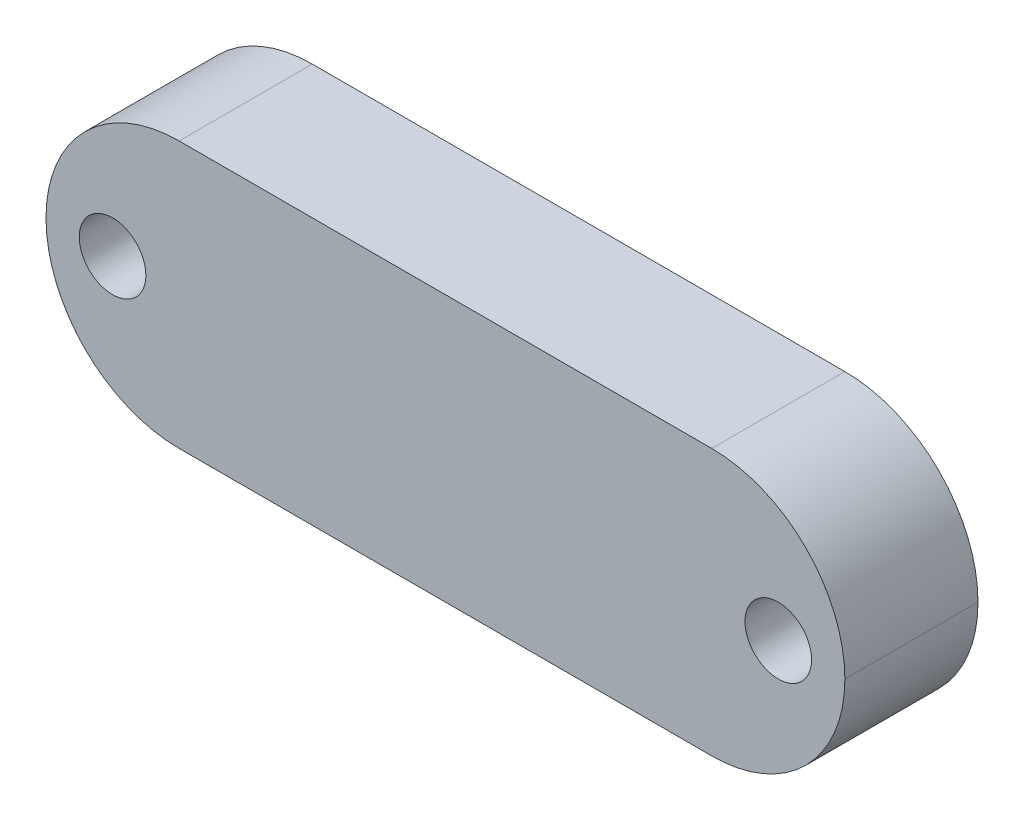
ISO-10303-21;
HEADER;
FILE_DESCRIPTION(('STEP AP214'),'2;1');
FILE_NAME('part.step','',(''),(''),'','','');
FILE_SCHEMA(('AUTOMOTIVE_DESIGN { 1 0 10303 214 1 1 1 1 }'));
ENDSEC;
DATA;
#1=APPLICATION_CONTEXT('core data for automotive mechanical design processes');
#2=APPLICATION_PROTOCOL_DEFINITION('international standard','automotive_design',2000,#1);
#3=PRODUCT_CONTEXT('',#1,'mechanical');
#4=PRODUCT('Part','Part','',(#3));
#5=PRODUCT_RELATED_PRODUCT_CATEGORY('part','',(#4));
#6=PRODUCT_DEFINITION_FORMATION('','',#4);
#7=PRODUCT_DEFINITION_CONTEXT('part definition',#1,'design');
#8=PRODUCT_DEFINITION('design','',#6,#7);
#9=PRODUCT_DEFINITION_SHAPE('','',#8);
#10=(LENGTH_UNIT() NAMED_UNIT(*) SI_UNIT(.MILLI.,.METRE.));
#11=(NAMED_UNIT(*) PLANE_ANGLE_UNIT() SI_UNIT($,.RADIAN.));
#12=(NAMED_UNIT(*) SI_UNIT($,.STERADIAN.) SOLID_ANGLE_UNIT());
#13=UNCERTAINTY_MEASURE_WITH_UNIT(LENGTH_MEASURE(1.E-05),#10,'distance_accuracy_value','');
#14=(GEOMETRIC_REPRESENTATION_CONTEXT(3) GLOBAL_UNCERTAINTY_ASSIGNED_CONTEXT((#13)) GLOBAL_UNIT_ASSIGNED_CONTEXT((#10,
#11,#12)) REPRESENTATION_CONTEXT('',''));
#15=CARTESIAN_POINT('',(0.,0.,0.));
#16=DIRECTION('',(0.,0.,1.));
#17=DIRECTION('',(1.,0.,0.));
#18=AXIS2_PLACEMENT_3D('',#15,#16,#17);
#19=CARTESIAN_POINT('',(0.,0.,10.));
#20=DIRECTION('',(0.,0.,1.));
#21=DIRECTION('',(1.,0.,0.));
#22=AXIS2_PLACEMENT_3D('',#19,#20,#21);
#23=PLANE('',#22);
#24=CARTESIAN_POINT('',(-25.,0.,10.));
#25=DIRECTION('',(0.,0.,1.));
#26=DIRECTION('',(1.,0.,0.));
#27=AXIS2_PLACEMENT_3D('',#24,#25,#26);
#28=CIRCLE('',#27,2.5);
#29=CARTESIAN_POINT('',(-22.5,0.,10.));
#30=VERTEX_POINT('',#29);
#31=EDGE_CURVE('E136',#30,#30,#28,.T.);
#32=ORIENTED_EDGE('',*,*,#31,.F.);
#33=EDGE_LOOP('',(#32));
#34=FACE_BOUND('',#33,.T.);
#35=DIRECTION('',(1.,0.,0.));
#36=VECTOR('',#35,1.);
#37=CARTESIAN_POINT('',(-30.,-10.,10.));
#38=LINE('',#37,#36);
#39=CARTESIAN_POINT('',(-20.,-10.,10.));
#40=VERTEX_POINT('',#39);
#41=CARTESIAN_POINT('',(20.,-10.,10.));
#42=VERTEX_POINT('',#41);
#43=EDGE_CURVE('E128',#40,#42,#38,.T.);
#44=ORIENTED_EDGE('',*,*,#43,.T.);
#45=CARTESIAN_POINT('',(20.,0.,10.));
#46=DIRECTION('',(0.,0.,1.));
#47=DIRECTION('',(1.,0.,0.));
#48=AXIS2_PLACEMENT_3D('',#45,#46,#47);
#49=CIRCLE('',#48,10.);
#50=CARTESIAN_POINT('',(30.,0.,10.));
#51=VERTEX_POINT('',#50);
#52=EDGE_CURVE('E123',#42,#51,#49,.T.);
#53=ORIENTED_EDGE('',*,*,#52,.T.);
#54=CARTESIAN_POINT('',(20.,0.,10.));
#55=DIRECTION('',(0.,0.,1.));
#56=DIRECTION('',(1.,0.,0.));
#57=AXIS2_PLACEMENT_3D('',#54,#55,#56);
#58=CIRCLE('',#57,10.);
#59=CARTESIAN_POINT('',(20.,10.,10.));
#60=VERTEX_POINT('',#59);
#61=EDGE_CURVE('E105',#51,#60,#58,.T.);
#62=ORIENTED_EDGE('',*,*,#61,.T.);
#63=DIRECTION('',(-1.,0.,0.));
#64=VECTOR('',#63,1.);
#65=CARTESIAN_POINT('',(-30.,10.,10.));
#66=LINE('',#65,#64);
#67=CARTESIAN_POINT('',(-20.,10.,10.));
#68=VERTEX_POINT('',#67);
#69=EDGE_CURVE('E133',#60,#68,#66,.T.);
#70=ORIENTED_EDGE('',*,*,#69,.T.);
#71=CARTESIAN_POINT('',(-20.,0.,10.));
#72=DIRECTION('',(0.,0.,1.));
#73=DIRECTION('',(1.,0.,0.));
#74=AXIS2_PLACEMENT_3D('',#71,#72,#73);
#75=CIRCLE('',#74,10.);
#76=CARTESIAN_POINT('',(-30.,0.,10.));
#77=VERTEX_POINT('',#76);
#78=EDGE_CURVE('E50',#68,#77,#75,.T.);
#79=ORIENTED_EDGE('',*,*,#78,.T.);
#80=CARTESIAN_POINT('',(-20.,0.,10.));
#81=DIRECTION('',(0.,0.,1.));
#82=DIRECTION('',(1.,0.,0.));
#83=AXIS2_PLACEMENT_3D('',#80,#81,#82);
#84=CIRCLE('',#83,10.);
#85=EDGE_CURVE('E120',#77,#40,#84,.T.);
#86=ORIENTED_EDGE('',*,*,#85,.T.);
#87=EDGE_LOOP('',(#44,#53,#62,#70,#79,#86));
#88=FACE_BOUND('',#87,.T.);
#89=CARTESIAN_POINT('',(25.,0.,10.));
#90=DIRECTION('',(0.,0.,1.));
#91=DIRECTION('',(1.,0.,0.));
#92=AXIS2_PLACEMENT_3D('',#89,#90,#91);
#93=CIRCLE('',#92,2.5);
#94=CARTESIAN_POINT('',(27.5,0.,10.));
#95=VERTEX_POINT('',#94);
#96=EDGE_CURVE('E184',#95,#95,#93,.T.);
#97=ORIENTED_EDGE('',*,*,#96,.F.);
#98=EDGE_LOOP('',(#97));
#99=FACE_BOUND('',#98,.T.);
#100=ADVANCED_FACE('F33',(#34,#88,#99),#23,.T.);
#101=CARTESIAN_POINT('',(0.,0.,0.));
#102=DIRECTION('',(0.,0.,1.));
#103=DIRECTION('',(1.,0.,0.));
#104=AXIS2_PLACEMENT_3D('',#101,#102,#103);
#105=PLANE('',#104);
#106=CARTESIAN_POINT('',(-25.,0.,0.));
#107=DIRECTION('',(0.,0.,1.));
#108=DIRECTION('',(1.,0.,0.));
#109=AXIS2_PLACEMENT_3D('',#106,#107,#108);
#110=CIRCLE('',#109,2.5);
#111=CARTESIAN_POINT('',(-22.5,0.,0.));
#112=VERTEX_POINT('',#111);
#113=EDGE_CURVE('E188',#112,#112,#110,.T.);
#114=ORIENTED_EDGE('',*,*,#113,.T.);
#115=EDGE_LOOP('',(#114));
#116=FACE_BOUND('',#115,.T.);
#117=CARTESIAN_POINT('',(20.,0.,0.));
#118=DIRECTION('',(0.,0.,1.));
#119=DIRECTION('',(1.,0.,0.));
#120=AXIS2_PLACEMENT_3D('',#117,#118,#119);
#121=CIRCLE('',#120,10.);
#122=CARTESIAN_POINT('',(20.,10.,0.));
#123=VERTEX_POINT('',#122);
#124=CARTESIAN_POINT('',(30.,0.,0.));
#125=VERTEX_POINT('',#124);
#126=EDGE_CURVE('E88',#123,#125,#121,.F.);
#127=ORIENTED_EDGE('',*,*,#126,.T.);
#128=CARTESIAN_POINT('',(20.,0.,0.));
#129=DIRECTION('',(0.,0.,1.));
#130=DIRECTION('',(1.,0.,0.));
#131=AXIS2_PLACEMENT_3D('',#128,#129,#130);
#132=CIRCLE('',#131,10.);
#133=CARTESIAN_POINT('',(20.,-10.,0.));
#134=VERTEX_POINT('',#133);
#135=EDGE_CURVE('E94',#125,#134,#132,.F.);
#136=ORIENTED_EDGE('',*,*,#135,.T.);
#137=DIRECTION('',(1.,0.,0.));
#138=VECTOR('',#137,1.);
#139=CARTESIAN_POINT('',(-30.,-10.,0.));
#140=LINE('',#139,#138);
#141=CARTESIAN_POINT('',(-20.,-10.,0.));
#142=VERTEX_POINT('',#141);
#143=EDGE_CURVE('E132',#142,#134,#140,.T.);
#144=ORIENTED_EDGE('',*,*,#143,.F.);
#145=CARTESIAN_POINT('',(-20.,0.,0.));
#146=DIRECTION('',(0.,0.,1.));
#147=DIRECTION('',(1.,0.,0.));
#148=AXIS2_PLACEMENT_3D('',#145,#146,#147);
#149=CIRCLE('',#148,10.);
#150=CARTESIAN_POINT('',(-30.,0.,0.));
#151=VERTEX_POINT('',#150);
#152=EDGE_CURVE('E99',#142,#151,#149,.F.);
#153=ORIENTED_EDGE('',*,*,#152,.T.);
#154=CARTESIAN_POINT('',(-20.,0.,0.));
#155=DIRECTION('',(0.,0.,1.));
#156=DIRECTION('',(1.,0.,0.));
#157=AXIS2_PLACEMENT_3D('',#154,#155,#156);
#158=CIRCLE('',#157,10.);
#159=CARTESIAN_POINT('',(-20.,10.,0.));
#160=VERTEX_POINT('',#159);
#161=EDGE_CURVE('E140',#151,#160,#158,.F.);
#162=ORIENTED_EDGE('',*,*,#161,.T.);
#163=DIRECTION('',(-1.,0.,0.));
#164=VECTOR('',#163,1.);
#165=CARTESIAN_POINT('',(-30.,10.,0.));
#166=LINE('',#165,#164);
#167=EDGE_CURVE('E96',#123,#160,#166,.T.);
#168=ORIENTED_EDGE('',*,*,#167,.F.);
#169=EDGE_LOOP('',(#127,#136,#144,#153,#162,#168));
#170=FACE_BOUND('',#169,.T.);
#171=CARTESIAN_POINT('',(25.,0.,0.));
#172=DIRECTION('',(0.,0.,1.));
#173=DIRECTION('',(1.,0.,0.));
#174=AXIS2_PLACEMENT_3D('',#171,#172,#173);
#175=CIRCLE('',#174,2.5);
#176=CARTESIAN_POINT('',(27.5,0.,0.));
#177=VERTEX_POINT('',#176);
#178=EDGE_CURVE('E107',#177,#177,#175,.T.);
#179=ORIENTED_EDGE('',*,*,#178,.T.);
#180=EDGE_LOOP('',(#179));
#181=FACE_BOUND('',#180,.T.);
#182=ADVANCED_FACE('F90',(#116,#170,#181),#105,.F.);
#183=CARTESIAN_POINT('',(-30.,10.,10.));
#184=DIRECTION('',(0.,-1.,0.));
#185=DIRECTION('',(0.,0.,-1.));
#186=AXIS2_PLACEMENT_3D('',#183,#184,#185);
#187=PLANE('',#186);
#188=ORIENTED_EDGE('',*,*,#69,.F.);
#189=DIRECTION('',(0.,0.,-1.));
#190=VECTOR('',#189,1.);
#191=CARTESIAN_POINT('',(20.,10.,10.));
#192=LINE('',#191,#190);
#193=EDGE_CURVE('E11',#60,#123,#192,.T.);
#194=ORIENTED_EDGE('',*,*,#193,.T.);
#195=ORIENTED_EDGE('',*,*,#167,.T.);
#196=DIRECTION('',(0.,0.,-1.));
#197=VECTOR('',#196,1.);
#198=CARTESIAN_POINT('',(-20.,10.,10.));
#199=LINE('',#198,#197);
#200=EDGE_CURVE('E42',#160,#68,#199,.F.);
#201=ORIENTED_EDGE('',*,*,#200,.T.);
#202=EDGE_LOOP('',(#188,#194,#195,#201));
#203=FACE_BOUND('',#202,.T.);
#204=ADVANCED_FACE('F159',(#203),#187,.F.);
#205=CARTESIAN_POINT('',(-30.,-10.,10.));
#206=DIRECTION('',(0.,1.,0.));
#207=DIRECTION('',(0.,0.,1.));
#208=AXIS2_PLACEMENT_3D('',#205,#206,#207);
#209=PLANE('',#208);
#210=ORIENTED_EDGE('',*,*,#143,.T.);
#211=DIRECTION('',(0.,0.,-1.));
#212=VECTOR('',#211,1.);
#213=CARTESIAN_POINT('',(20.,-10.,10.));
#214=LINE('',#213,#212);
#215=EDGE_CURVE('E111',#134,#42,#214,.F.);
#216=ORIENTED_EDGE('',*,*,#215,.T.);
#217=ORIENTED_EDGE('',*,*,#43,.F.);
#218=DIRECTION('',(0.,0.,-1.));
#219=VECTOR('',#218,1.);
#220=CARTESIAN_POINT('',(-20.,-10.,10.));
#221=LINE('',#220,#219);
#222=EDGE_CURVE('E112',#40,#142,#221,.T.);
#223=ORIENTED_EDGE('',*,*,#222,.T.);
#224=EDGE_LOOP('',(#210,#216,#217,#223));
#225=FACE_BOUND('',#224,.T.);
#226=ADVANCED_FACE('F130',(#225),#209,.F.);
#227=CARTESIAN_POINT('',(-25.,0.,10.));
#228=DIRECTION('',(0.,0.,-1.));
#229=DIRECTION('',(-1.,0.,0.));
#230=AXIS2_PLACEMENT_3D('',#227,#228,#229);
#231=CYLINDRICAL_SURFACE('',#230,2.5);
#232=ORIENTED_EDGE('',*,*,#31,.T.);
#233=EDGE_LOOP('',(#232));
#234=FACE_BOUND('',#233,.T.);
#235=ORIENTED_EDGE('',*,*,#113,.F.);
#236=EDGE_LOOP('',(#235));
#237=FACE_BOUND('',#236,.T.);
#238=ADVANCED_FACE('F164',(#234,#237),#231,.F.);
#239=CARTESIAN_POINT('',(25.,0.,10.));
#240=DIRECTION('',(0.,0.,-1.));
#241=DIRECTION('',(-1.,0.,0.));
#242=AXIS2_PLACEMENT_3D('',#239,#240,#241);
#243=CYLINDRICAL_SURFACE('',#242,2.5);
#244=ORIENTED_EDGE('',*,*,#96,.T.);
#245=EDGE_LOOP('',(#244));
#246=FACE_BOUND('',#245,.T.);
#247=ORIENTED_EDGE('',*,*,#178,.F.);
#248=EDGE_LOOP('',(#247));
#249=FACE_BOUND('',#248,.T.);
#250=ADVANCED_FACE('F173',(#246,#249),#243,.F.);
#251=CARTESIAN_POINT('',(20.,0.,10.));
#252=DIRECTION('',(0.,0.,-1.));
#253=DIRECTION('',(-1.,0.,0.));
#254=AXIS2_PLACEMENT_3D('',#251,#252,#253);
#255=CYLINDRICAL_SURFACE('',#254,10.);
#256=ORIENTED_EDGE('',*,*,#193,.F.);
#257=ORIENTED_EDGE('',*,*,#61,.F.);
#258=DIRECTION('',(0.,0.,-1.));
#259=VECTOR('',#258,1.);
#260=CARTESIAN_POINT('',(30.,0.,10.));
#261=LINE('',#260,#259);
#262=EDGE_CURVE('E103',#125,#51,#261,.F.);
#263=ORIENTED_EDGE('',*,*,#262,.F.);
#264=ORIENTED_EDGE('',*,*,#126,.F.);
#265=EDGE_LOOP('',(#256,#257,#263,#264));
#266=FACE_BOUND('',#265,.T.);
#267=ADVANCED_FACE('F104',(#266),#255,.T.);
#268=CARTESIAN_POINT('',(20.,0.,10.));
#269=DIRECTION('',(0.,0.,-1.));
#270=DIRECTION('',(-1.,0.,0.));
#271=AXIS2_PLACEMENT_3D('',#268,#269,#270);
#272=CYLINDRICAL_SURFACE('',#271,10.);
#273=ORIENTED_EDGE('',*,*,#52,.F.);
#274=ORIENTED_EDGE('',*,*,#215,.F.);
#275=ORIENTED_EDGE('',*,*,#135,.F.);
#276=ORIENTED_EDGE('',*,*,#262,.T.);
#277=EDGE_LOOP('',(#273,#274,#275,#276));
#278=FACE_BOUND('',#277,.T.);
#279=ADVANCED_FACE('F109',(#278),#272,.T.);
#280=CARTESIAN_POINT('',(-20.,0.,10.));
#281=DIRECTION('',(0.,0.,-1.));
#282=DIRECTION('',(-1.,0.,0.));
#283=AXIS2_PLACEMENT_3D('',#280,#281,#282);
#284=CYLINDRICAL_SURFACE('',#283,10.);
#285=DIRECTION('',(0.,0.,-1.));
#286=VECTOR('',#285,1.);
#287=CARTESIAN_POINT('',(-30.,0.,10.));
#288=LINE('',#287,#286);
#289=EDGE_CURVE('E37',#77,#151,#288,.T.);
#290=ORIENTED_EDGE('',*,*,#289,.F.);
#291=ORIENTED_EDGE('',*,*,#78,.F.);
#292=ORIENTED_EDGE('',*,*,#200,.F.);
#293=ORIENTED_EDGE('',*,*,#161,.F.);
#294=EDGE_LOOP('',(#290,#291,#292,#293));
#295=FACE_BOUND('',#294,.T.);
#296=ADVANCED_FACE('F35',(#295),#284,.T.);
#297=CARTESIAN_POINT('',(-20.,0.,10.));
#298=DIRECTION('',(0.,0.,-1.));
#299=DIRECTION('',(-1.,0.,0.));
#300=AXIS2_PLACEMENT_3D('',#297,#298,#299);
#301=CYLINDRICAL_SURFACE('',#300,10.);
#302=ORIENTED_EDGE('',*,*,#85,.F.);
#303=ORIENTED_EDGE('',*,*,#289,.T.);
#304=ORIENTED_EDGE('',*,*,#152,.F.);
#305=ORIENTED_EDGE('',*,*,#222,.F.);
#306=EDGE_LOOP('',(#302,#303,#304,#305));
#307=FACE_BOUND('',#306,.T.);
#308=ADVANCED_FACE('F146',(#307),#301,.T.);
#309=CLOSED_SHELL('',(#100,#182,#204,#226,#238,#250,#267,#279,#296,#308));
#310=MANIFOLD_SOLID_BREP('B2',#309);
#311=ADVANCED_BREP_SHAPE_REPRESENTATION('',(#18,#310),#14);
#312=SHAPE_DEFINITION_REPRESENTATION(#9,#311);
ENDSEC;
END-ISO-10303-21;
